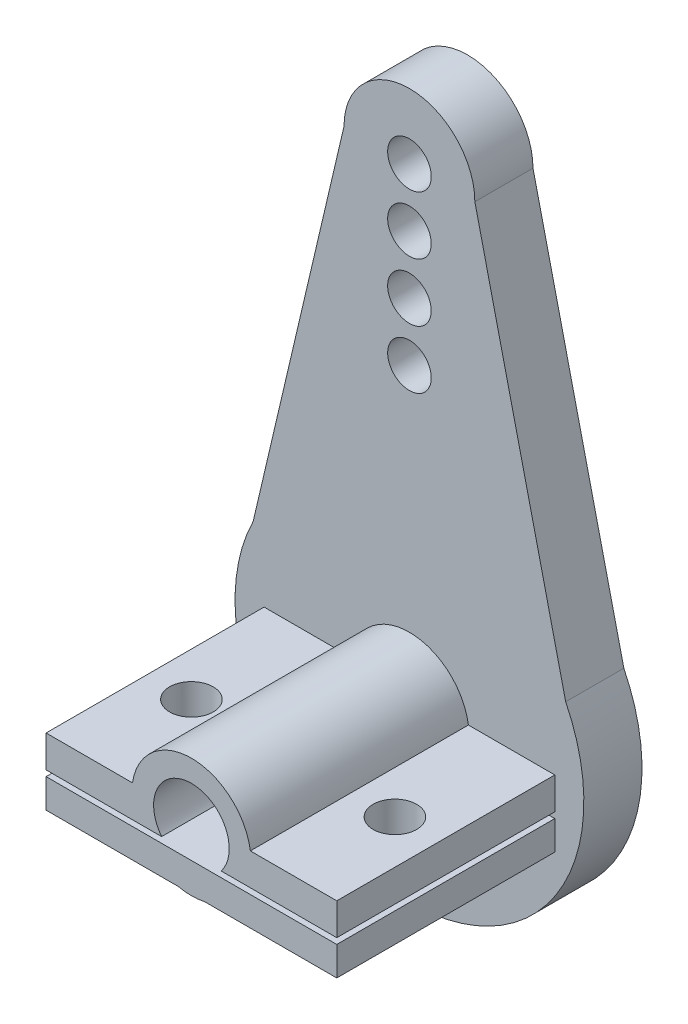
ISO-10303-21;
HEADER;
FILE_DESCRIPTION(('STEP AP214'),'2;1');
FILE_NAME('part.step','',(''),(''),'','','');
FILE_SCHEMA(('AUTOMOTIVE_DESIGN { 1 0 10303 214 1 1 1 1 }'));
ENDSEC;
DATA;
#1=APPLICATION_CONTEXT('core data for automotive mechanical design processes');
#2=APPLICATION_PROTOCOL_DEFINITION('international standard','automotive_design',2000,#1);
#3=PRODUCT_CONTEXT('',#1,'mechanical');
#4=PRODUCT('Part','Part','',(#3));
#5=PRODUCT_RELATED_PRODUCT_CATEGORY('part','',(#4));
#6=PRODUCT_DEFINITION_FORMATION('','',#4);
#7=PRODUCT_DEFINITION_CONTEXT('part definition',#1,'design');
#8=PRODUCT_DEFINITION('design','',#6,#7);
#9=PRODUCT_DEFINITION_SHAPE('','',#8);
#10=(LENGTH_UNIT() NAMED_UNIT(*) SI_UNIT(.MILLI.,.METRE.));
#11=(NAMED_UNIT(*) PLANE_ANGLE_UNIT() SI_UNIT($,.RADIAN.));
#12=(NAMED_UNIT(*) SI_UNIT($,.STERADIAN.) SOLID_ANGLE_UNIT());
#13=UNCERTAINTY_MEASURE_WITH_UNIT(LENGTH_MEASURE(1.E-05),#10,'distance_accuracy_value','');
#14=(GEOMETRIC_REPRESENTATION_CONTEXT(3) GLOBAL_UNCERTAINTY_ASSIGNED_CONTEXT((#13)) GLOBAL_UNIT_ASSIGNED_CONTEXT((#10,
#11,#12)) REPRESENTATION_CONTEXT('',''));
#15=CARTESIAN_POINT('',(0.,0.,0.));
#16=DIRECTION('',(0.,0.,1.));
#17=DIRECTION('',(1.,0.,0.));
#18=AXIS2_PLACEMENT_3D('',#15,#16,#17);
#19=CARTESIAN_POINT('',(0.,0.,19.));
#20=DIRECTION('',(0.,0.,-1.));
#21=DIRECTION('',(-1.,0.,0.));
#22=AXIS2_PLACEMENT_3D('',#19,#20,#21);
#23=CYLINDRICAL_SURFACE('',#22,4.1);
#24=DIRECTION('',(0.,0.,-1.));
#25=VECTOR('',#24,1.);
#26=CARTESIAN_POINT('',(4.05585995813465,0.6,19.));
#27=LINE('',#26,#25);
#28=CARTESIAN_POINT('',(4.05585995813465,0.6,4.));
#29=VERTEX_POINT('',#28);
#30=CARTESIAN_POINT('',(4.05585995813465,0.6,19.));
#31=VERTEX_POINT('',#30);
#32=EDGE_CURVE('E188',#29,#31,#27,.F.);
#33=ORIENTED_EDGE('',*,*,#32,.F.);
#34=CARTESIAN_POINT('',(0.,0.,4.));
#35=DIRECTION('',(0.,0.,1.));
#36=DIRECTION('',(1.,0.,0.));
#37=AXIS2_PLACEMENT_3D('',#34,#35,#36);
#38=CIRCLE('',#37,4.1);
#39=CARTESIAN_POINT('',(-4.05585995813465,0.600000000000001,4.));
#40=VERTEX_POINT('',#39);
#41=EDGE_CURVE('E288',#29,#40,#38,.T.);
#42=ORIENTED_EDGE('',*,*,#41,.T.);
#43=DIRECTION('',(0.,0.,-1.));
#44=VECTOR('',#43,1.);
#45=CARTESIAN_POINT('',(-4.05585995813465,0.600000000000001,19.));
#46=LINE('',#45,#44);
#47=CARTESIAN_POINT('',(-4.05585995813465,0.600000000000001,19.));
#48=VERTEX_POINT('',#47);
#49=EDGE_CURVE('E231',#48,#40,#46,.T.);
#50=ORIENTED_EDGE('',*,*,#49,.F.);
#51=CARTESIAN_POINT('',(0.,0.,19.));
#52=DIRECTION('',(0.,0.,1.));
#53=DIRECTION('',(1.,0.,0.));
#54=AXIS2_PLACEMENT_3D('',#51,#52,#53);
#55=CIRCLE('',#54,4.1);
#56=EDGE_CURVE('E289',#31,#48,#55,.T.);
#57=ORIENTED_EDGE('',*,*,#56,.F.);
#58=EDGE_LOOP('',(#33,#42,#50,#57));
#59=FACE_BOUND('',#58,.T.);
#60=ADVANCED_FACE('F39',(#59),#23,.T.);
#61=CARTESIAN_POINT('',(0.,0.,4.));
#62=DIRECTION('',(0.,0.,1.));
#63=DIRECTION('',(1.,0.,0.));
#64=AXIS2_PLACEMENT_3D('',#61,#62,#63);
#65=PLANE('',#64);
#66=DIRECTION('',(1.,0.,0.));
#67=VECTOR('',#66,1.);
#68=CARTESIAN_POINT('',(0.,-2.,4.));
#69=LINE('',#68,#67);
#70=CARTESIAN_POINT('',(-10.,-2.,4.));
#71=VERTEX_POINT('',#70);
#72=CARTESIAN_POINT('',(10.,-2.,4.));
#73=VERTEX_POINT('',#72);
#74=EDGE_CURVE('E377',#71,#73,#69,.T.);
#75=ORIENTED_EDGE('',*,*,#74,.T.);
#76=DIRECTION('',(0.,1.,0.));
#77=VECTOR('',#76,1.);
#78=CARTESIAN_POINT('',(10.,-2.,4.));
#79=LINE('',#78,#77);
#80=CARTESIAN_POINT('',(10.,-4.,4.));
#81=VERTEX_POINT('',#80);
#82=EDGE_CURVE('E250',#81,#73,#79,.T.);
#83=ORIENTED_EDGE('',*,*,#82,.F.);
#84=DIRECTION('',(1.,0.,0.));
#85=VECTOR('',#84,1.);
#86=CARTESIAN_POINT('',(-10.,-4.,4.));
#87=LINE('',#86,#85);
#88=CARTESIAN_POINT('',(0.899999999999999,-4.,4.));
#89=VERTEX_POINT('',#88);
#90=EDGE_CURVE('E265',#89,#81,#87,.T.);
#91=ORIENTED_EDGE('',*,*,#90,.F.);
#92=CARTESIAN_POINT('',(-0.899999999999999,-4.,4.));
#93=VERTEX_POINT('',#92);
#94=EDGE_CURVE('E293',#93,#89,#38,.T.);
#95=ORIENTED_EDGE('',*,*,#94,.F.);
#96=CARTESIAN_POINT('',(-10.,-4.,4.));
#97=VERTEX_POINT('',#96);
#98=EDGE_CURVE('E266',#97,#93,#87,.T.);
#99=ORIENTED_EDGE('',*,*,#98,.F.);
#100=DIRECTION('',(0.,-1.,0.));
#101=VECTOR('',#100,1.);
#102=CARTESIAN_POINT('',(-10.,-2.,4.));
#103=LINE('',#102,#101);
#104=EDGE_CURVE('E244',#71,#97,#103,.T.);
#105=ORIENTED_EDGE('',*,*,#104,.F.);
#106=EDGE_LOOP('',(#75,#83,#91,#95,#99,#105));
#107=FACE_BOUND('',#106,.T.);
#108=CARTESIAN_POINT('',(0.,32.,4.));
#109=DIRECTION('',(0.,0.,1.));
#110=DIRECTION('',(1.,0.,0.));
#111=AXIS2_PLACEMENT_3D('',#108,#109,#110);
#112=CIRCLE('',#111,1.5);
#113=CARTESIAN_POINT('',(1.5,32.,4.));
#114=VERTEX_POINT('',#113);
#115=EDGE_CURVE('E301',#114,#114,#112,.F.);
#116=ORIENTED_EDGE('',*,*,#115,.T.);
#117=EDGE_LOOP('',(#116));
#118=FACE_BOUND('',#117,.T.);
#119=CARTESIAN_POINT('',(0.,24.,4.));
#120=DIRECTION('',(0.,0.,1.));
#121=DIRECTION('',(1.,0.,0.));
#122=AXIS2_PLACEMENT_3D('',#119,#120,#121);
#123=CIRCLE('',#122,1.5);
#124=CARTESIAN_POINT('',(1.5,24.,4.));
#125=VERTEX_POINT('',#124);
#126=EDGE_CURVE('E311',#125,#125,#123,.F.);
#127=ORIENTED_EDGE('',*,*,#126,.T.);
#128=EDGE_LOOP('',(#127));
#129=FACE_BOUND('',#128,.T.);
#130=CARTESIAN_POINT('',(0.,20.,4.));
#131=DIRECTION('',(0.,0.,1.));
#132=DIRECTION('',(1.,0.,0.));
#133=AXIS2_PLACEMENT_3D('',#130,#131,#132);
#134=CIRCLE('',#133,1.5);
#135=CARTESIAN_POINT('',(1.5,20.,4.));
#136=VERTEX_POINT('',#135);
#137=EDGE_CURVE('E310',#136,#136,#134,.F.);
#138=ORIENTED_EDGE('',*,*,#137,.T.);
#139=EDGE_LOOP('',(#138));
#140=FACE_BOUND('',#139,.T.);
#141=CARTESIAN_POINT('',(0.,28.,4.));
#142=DIRECTION('',(0.,0.,1.));
#143=DIRECTION('',(1.,0.,0.));
#144=AXIS2_PLACEMENT_3D('',#141,#142,#143);
#145=CIRCLE('',#144,1.5);
#146=CARTESIAN_POINT('',(1.5,28.,4.));
#147=VERTEX_POINT('',#146);
#148=EDGE_CURVE('E318',#147,#147,#145,.F.);
#149=ORIENTED_EDGE('',*,*,#148,.T.);
#150=EDGE_LOOP('',(#149));
#151=FACE_BOUND('',#150,.T.);
#152=DIRECTION('',(0.228191322789328,-0.973616310567801,0.));
#153=VECTOR('',#152,1.);
#154=CARTESIAN_POINT('',(4.5,32.,4.));
#155=LINE('',#154,#153);
#156=CARTESIAN_POINT('',(4.5,32.,4.));
#157=VERTEX_POINT('',#156);
#158=CARTESIAN_POINT('',(10.7502892848878,5.33209905114555,4.));
#159=VERTEX_POINT('',#158);
#160=EDGE_CURVE('E336',#157,#159,#155,.T.);
#161=ORIENTED_EDGE('',*,*,#160,.F.);
#162=CARTESIAN_POINT('',(0.,32.,4.));
#163=DIRECTION('',(0.,0.,1.));
#164=DIRECTION('',(1.,0.,0.));
#165=AXIS2_PLACEMENT_3D('',#162,#163,#164);
#166=CIRCLE('',#165,4.5);
#167=CARTESIAN_POINT('',(-4.5,32.,4.));
#168=VERTEX_POINT('',#167);
#169=EDGE_CURVE('E329',#157,#168,#166,.T.);
#170=ORIENTED_EDGE('',*,*,#169,.T.);
#171=DIRECTION('',(0.228191322789328,0.973616310567801,0.));
#172=VECTOR('',#171,1.);
#173=CARTESIAN_POINT('',(-12.,0.,4.));
#174=LINE('',#173,#172);
#175=CARTESIAN_POINT('',(-10.7502892848878,5.33209905114555,4.));
#176=VERTEX_POINT('',#175);
#177=EDGE_CURVE('E340',#176,#168,#174,.T.);
#178=ORIENTED_EDGE('',*,*,#177,.F.);
#179=CARTESIAN_POINT('',(0.,0.,4.));
#180=DIRECTION('',(0.,0.,1.));
#181=DIRECTION('',(1.,0.,0.));
#182=AXIS2_PLACEMENT_3D('',#179,#180,#181);
#183=CIRCLE('',#182,12.);
#184=EDGE_CURVE('E367',#176,#159,#183,.T.);
#185=ORIENTED_EDGE('',*,*,#184,.T.);
#186=EDGE_LOOP('',(#161,#170,#178,#185));
#187=FACE_BOUND('',#186,.T.);
#188=DIRECTION('',(0.,1.,0.));
#189=VECTOR('',#188,1.);
#190=CARTESIAN_POINT('',(10.,-1.6,4.));
#191=LINE('',#190,#189);
#192=CARTESIAN_POINT('',(10.,-1.6,4.));
#193=VERTEX_POINT('',#192);
#194=CARTESIAN_POINT('',(10.,0.6,4.));
#195=VERTEX_POINT('',#194);
#196=EDGE_CURVE('E198',#193,#195,#191,.T.);
#197=ORIENTED_EDGE('',*,*,#196,.F.);
#198=DIRECTION('',(-1.,0.,0.));
#199=VECTOR('',#198,1.);
#200=CARTESIAN_POINT('',(-10.,-1.6,4.));
#201=LINE('',#200,#199);
#202=CARTESIAN_POINT('',(2.04939015319192,-1.6,4.));
#203=VERTEX_POINT('',#202);
#204=EDGE_CURVE('E184',#193,#203,#201,.T.);
#205=ORIENTED_EDGE('',*,*,#204,.T.);
#206=CARTESIAN_POINT('',(0.,0.,4.));
#207=DIRECTION('',(0.,0.,1.));
#208=DIRECTION('',(1.,0.,0.));
#209=AXIS2_PLACEMENT_3D('',#206,#207,#208);
#210=CIRCLE('',#209,2.6);
#211=CARTESIAN_POINT('',(-2.04939015319192,-1.6,4.));
#212=VERTEX_POINT('',#211);
#213=EDGE_CURVE('E371',#212,#203,#210,.F.);
#214=ORIENTED_EDGE('',*,*,#213,.F.);
#215=CARTESIAN_POINT('',(-10.,-1.6,4.));
#216=VERTEX_POINT('',#215);
#217=EDGE_CURVE('E63',#212,#216,#201,.T.);
#218=ORIENTED_EDGE('',*,*,#217,.T.);
#219=DIRECTION('',(0.,-1.,0.));
#220=VECTOR('',#219,1.);
#221=CARTESIAN_POINT('',(-10.,-1.6,4.));
#222=LINE('',#221,#220);
#223=CARTESIAN_POINT('',(-10.,0.6,4.));
#224=VERTEX_POINT('',#223);
#225=EDGE_CURVE('E215',#224,#216,#222,.T.);
#226=ORIENTED_EDGE('',*,*,#225,.F.);
#227=DIRECTION('',(-1.,0.,0.));
#228=VECTOR('',#227,1.);
#229=CARTESIAN_POINT('',(-3.0448472304101,0.600000000000001,4.));
#230=LINE('',#229,#228);
#231=EDGE_CURVE('E210',#40,#224,#230,.T.);
#232=ORIENTED_EDGE('',*,*,#231,.F.);
#233=ORIENTED_EDGE('',*,*,#41,.F.);
#234=DIRECTION('',(-1.,0.,0.));
#235=VECTOR('',#234,1.);
#236=CARTESIAN_POINT('',(3.3540621182031,0.6,4.));
#237=LINE('',#236,#235);
#238=EDGE_CURVE('E193',#195,#29,#237,.T.);
#239=ORIENTED_EDGE('',*,*,#238,.F.);
#240=EDGE_LOOP('',(#197,#205,#214,#218,#226,#232,#233,#239));
#241=FACE_BOUND('',#240,.T.);
#242=ADVANCED_FACE('F398',(#107,#118,#129,#140,#151,#187,#241),#65,.T.);
#243=CARTESIAN_POINT('',(0.,0.,19.));
#244=DIRECTION('',(0.,0.,-1.));
#245=DIRECTION('',(-1.,0.,0.));
#246=AXIS2_PLACEMENT_3D('',#243,#244,#245);
#247=CYLINDRICAL_SURFACE('',#246,2.6);
#248=CARTESIAN_POINT('',(0.,0.,19.));
#249=DIRECTION('',(0.,0.,1.));
#250=DIRECTION('',(1.,0.,0.));
#251=AXIS2_PLACEMENT_3D('',#248,#249,#250);
#252=CIRCLE('',#251,2.6);
#253=CARTESIAN_POINT('',(2.04939015319192,-1.6,19.));
#254=VERTEX_POINT('',#253);
#255=CARTESIAN_POINT('',(-2.04939015319192,-1.6,19.));
#256=VERTEX_POINT('',#255);
#257=EDGE_CURVE('E173',#254,#256,#252,.T.);
#258=ORIENTED_EDGE('',*,*,#257,.T.);
#259=DIRECTION('',(0.,0.,-1.));
#260=VECTOR('',#259,1.);
#261=CARTESIAN_POINT('',(-2.04939015319192,-1.6,19.));
#262=LINE('',#261,#260);
#263=EDGE_CURVE('E240',#256,#212,#262,.T.);
#264=ORIENTED_EDGE('',*,*,#263,.T.);
#265=ORIENTED_EDGE('',*,*,#213,.T.);
#266=DIRECTION('',(0.,0.,-1.));
#267=VECTOR('',#266,1.);
#268=CARTESIAN_POINT('',(2.04939015319192,-1.6,19.));
#269=LINE('',#268,#267);
#270=EDGE_CURVE('E178',#203,#254,#269,.F.);
#271=ORIENTED_EDGE('',*,*,#270,.T.);
#272=EDGE_LOOP('',(#258,#264,#265,#271));
#273=FACE_BOUND('',#272,.T.);
#274=ADVANCED_FACE('F401',(#273),#247,.F.);
#275=CARTESIAN_POINT('',(0.,0.,19.));
#276=DIRECTION('',(0.,0.,1.));
#277=DIRECTION('',(1.,0.,0.));
#278=AXIS2_PLACEMENT_3D('',#275,#276,#277);
#279=PLANE('',#278);
#280=DIRECTION('',(0.,1.,0.));
#281=VECTOR('',#280,1.);
#282=CARTESIAN_POINT('',(10.,-2.,19.));
#283=LINE('',#282,#281);
#284=CARTESIAN_POINT('',(10.,-4.,19.));
#285=VERTEX_POINT('',#284);
#286=CARTESIAN_POINT('',(10.,-2.,19.));
#287=VERTEX_POINT('',#286);
#288=EDGE_CURVE('E254',#285,#287,#283,.T.);
#289=ORIENTED_EDGE('',*,*,#288,.T.);
#290=DIRECTION('',(-1.,0.,0.));
#291=VECTOR('',#290,1.);
#292=CARTESIAN_POINT('',(-10.,-2.,19.));
#293=LINE('',#292,#291);
#294=CARTESIAN_POINT('',(-10.,-2.,19.));
#295=VERTEX_POINT('',#294);
#296=EDGE_CURVE('E258',#287,#295,#293,.T.);
#297=ORIENTED_EDGE('',*,*,#296,.T.);
#298=DIRECTION('',(0.,-1.,0.));
#299=VECTOR('',#298,1.);
#300=CARTESIAN_POINT('',(-10.,-2.,19.));
#301=LINE('',#300,#299);
#302=CARTESIAN_POINT('',(-10.,-4.,19.));
#303=VERTEX_POINT('',#302);
#304=EDGE_CURVE('E245',#295,#303,#301,.T.);
#305=ORIENTED_EDGE('',*,*,#304,.T.);
#306=DIRECTION('',(1.,0.,0.));
#307=VECTOR('',#306,1.);
#308=CARTESIAN_POINT('',(-10.,-4.,19.));
#309=LINE('',#308,#307);
#310=CARTESIAN_POINT('',(-0.899999999999999,-4.,19.));
#311=VERTEX_POINT('',#310);
#312=EDGE_CURVE('E251',#303,#311,#309,.T.);
#313=ORIENTED_EDGE('',*,*,#312,.T.);
#314=CARTESIAN_POINT('',(0.899999999999999,-4.,19.));
#315=VERTEX_POINT('',#314);
#316=EDGE_CURVE('E292',#311,#315,#55,.T.);
#317=ORIENTED_EDGE('',*,*,#316,.T.);
#318=EDGE_CURVE('E249',#315,#285,#309,.T.);
#319=ORIENTED_EDGE('',*,*,#318,.T.);
#320=EDGE_LOOP('',(#289,#297,#305,#313,#317,#319));
#321=FACE_BOUND('',#320,.T.);
#322=ADVANCED_FACE('F447',(#321),#279,.T.);
#323=ORIENTED_EDGE('',*,*,#257,.F.);
#324=DIRECTION('',(-1.,0.,0.));
#325=VECTOR('',#324,1.);
#326=CARTESIAN_POINT('',(-10.,-1.6,19.));
#327=LINE('',#326,#325);
#328=CARTESIAN_POINT('',(10.,-1.6,19.));
#329=VERTEX_POINT('',#328);
#330=EDGE_CURVE('E165',#329,#254,#327,.T.);
#331=ORIENTED_EDGE('',*,*,#330,.F.);
#332=DIRECTION('',(0.,1.,0.));
#333=VECTOR('',#332,1.);
#334=CARTESIAN_POINT('',(10.,-1.6,19.));
#335=LINE('',#334,#333);
#336=CARTESIAN_POINT('',(10.,0.6,19.));
#337=VERTEX_POINT('',#336);
#338=EDGE_CURVE('E170',#329,#337,#335,.T.);
#339=ORIENTED_EDGE('',*,*,#338,.T.);
#340=DIRECTION('',(-1.,0.,0.));
#341=VECTOR('',#340,1.);
#342=CARTESIAN_POINT('',(3.3540621182031,0.6,19.));
#343=LINE('',#342,#341);
#344=EDGE_CURVE('E192',#337,#31,#343,.T.);
#345=ORIENTED_EDGE('',*,*,#344,.T.);
#346=ORIENTED_EDGE('',*,*,#56,.T.);
#347=DIRECTION('',(-1.,0.,0.));
#348=VECTOR('',#347,1.);
#349=CARTESIAN_POINT('',(-3.0448472304101,0.600000000000001,19.));
#350=LINE('',#349,#348);
#351=CARTESIAN_POINT('',(-10.,0.6,19.));
#352=VERTEX_POINT('',#351);
#353=EDGE_CURVE('E211',#48,#352,#350,.T.);
#354=ORIENTED_EDGE('',*,*,#353,.T.);
#355=DIRECTION('',(0.,-1.,0.));
#356=VECTOR('',#355,1.);
#357=CARTESIAN_POINT('',(-10.,-1.6,19.));
#358=LINE('',#357,#356);
#359=CARTESIAN_POINT('',(-10.,-1.6,19.));
#360=VERTEX_POINT('',#359);
#361=EDGE_CURVE('E214',#352,#360,#358,.T.);
#362=ORIENTED_EDGE('',*,*,#361,.T.);
#363=EDGE_CURVE('E179',#256,#360,#327,.T.);
#364=ORIENTED_EDGE('',*,*,#363,.F.);
#365=EDGE_LOOP('',(#323,#331,#339,#345,#346,#354,#362,#364));
#366=FACE_BOUND('',#365,.T.);
#367=ADVANCED_FACE('F167',(#366),#279,.T.);
#368=DIRECTION('',(0.,0.,-1.));
#369=VECTOR('',#368,1.);
#370=CARTESIAN_POINT('',(0.899999999999999,-4.,19.));
#371=LINE('',#370,#369);
#372=EDGE_CURVE('E11',#315,#89,#371,.T.);
#373=ORIENTED_EDGE('',*,*,#372,.F.);
#374=ORIENTED_EDGE('',*,*,#316,.F.);
#375=DIRECTION('',(0.,0.,-1.));
#376=VECTOR('',#375,1.);
#377=CARTESIAN_POINT('',(-0.899999999999999,-4.,19.));
#378=LINE('',#377,#376);
#379=EDGE_CURVE('E48',#93,#311,#378,.F.);
#380=ORIENTED_EDGE('',*,*,#379,.F.);
#381=ORIENTED_EDGE('',*,*,#94,.T.);
#382=EDGE_LOOP('',(#373,#374,#380,#381));
#383=FACE_BOUND('',#382,.T.);
#384=ADVANCED_FACE('F391',(#383),#23,.T.);
#385=CARTESIAN_POINT('',(0.,0.,4.));
#386=DIRECTION('',(0.,0.,-1.));
#387=DIRECTION('',(-1.,0.,0.));
#388=AXIS2_PLACEMENT_3D('',#385,#386,#387);
#389=CYLINDRICAL_SURFACE('',#388,12.);
#390=ORIENTED_EDGE('',*,*,#184,.F.);
#391=DIRECTION('',(0.,0.,-1.));
#392=VECTOR('',#391,1.);
#393=CARTESIAN_POINT('',(-10.7502892848878,5.33209905114556,4.));
#394=LINE('',#393,#392);
#395=CARTESIAN_POINT('',(-10.7502892848878,5.33209905114555,0.));
#396=VERTEX_POINT('',#395);
#397=EDGE_CURVE('E362',#176,#396,#394,.T.);
#398=ORIENTED_EDGE('',*,*,#397,.T.);
#399=CARTESIAN_POINT('',(0.,0.,0.));
#400=DIRECTION('',(0.,0.,1.));
#401=DIRECTION('',(1.,0.,0.));
#402=AXIS2_PLACEMENT_3D('',#399,#400,#401);
#403=CIRCLE('',#402,12.);
#404=CARTESIAN_POINT('',(10.7502892848878,5.33209905114555,0.));
#405=VERTEX_POINT('',#404);
#406=EDGE_CURVE('E366',#396,#405,#403,.T.);
#407=ORIENTED_EDGE('',*,*,#406,.T.);
#408=DIRECTION('',(0.,0.,-1.));
#409=VECTOR('',#408,1.);
#410=CARTESIAN_POINT('',(10.7502892848878,5.33209905114556,4.));
#411=LINE('',#410,#409);
#412=EDGE_CURVE('E356',#405,#159,#411,.F.);
#413=ORIENTED_EDGE('',*,*,#412,.T.);
#414=EDGE_LOOP('',(#390,#398,#407,#413));
#415=FACE_BOUND('',#414,.T.);
#416=ADVANCED_FACE('F41',(#415),#389,.T.);
#417=CARTESIAN_POINT('',(0.,0.,0.));
#418=DIRECTION('',(0.,0.,1.));
#419=DIRECTION('',(1.,0.,0.));
#420=AXIS2_PLACEMENT_3D('',#417,#418,#419);
#421=PLANE('',#420);
#422=CARTESIAN_POINT('',(0.,32.,0.));
#423=DIRECTION('',(0.,0.,-1.));
#424=DIRECTION('',(-1.,0.,0.));
#425=AXIS2_PLACEMENT_3D('',#422,#423,#424);
#426=CIRCLE('',#425,1.5);
#427=CARTESIAN_POINT('',(-1.5,32.,0.));
#428=VERTEX_POINT('',#427);
#429=EDGE_CURVE('E296',#428,#428,#426,.T.);
#430=ORIENTED_EDGE('',*,*,#429,.F.);
#431=EDGE_LOOP('',(#430));
#432=FACE_BOUND('',#431,.T.);
#433=CARTESIAN_POINT('',(0.,24.,0.));
#434=DIRECTION('',(0.,0.,-1.));
#435=DIRECTION('',(-1.,0.,0.));
#436=AXIS2_PLACEMENT_3D('',#433,#434,#435);
#437=CIRCLE('',#436,1.5);
#438=CARTESIAN_POINT('',(-1.5,24.,0.));
#439=VERTEX_POINT('',#438);
#440=EDGE_CURVE('E306',#439,#439,#437,.T.);
#441=ORIENTED_EDGE('',*,*,#440,.F.);
#442=EDGE_LOOP('',(#441));
#443=FACE_BOUND('',#442,.T.);
#444=CARTESIAN_POINT('',(0.,20.,0.));
#445=DIRECTION('',(0.,0.,-1.));
#446=DIRECTION('',(-1.,0.,0.));
#447=AXIS2_PLACEMENT_3D('',#444,#445,#446);
#448=CIRCLE('',#447,1.5);
#449=CARTESIAN_POINT('',(-1.5,20.,0.));
#450=VERTEX_POINT('',#449);
#451=EDGE_CURVE('E322',#450,#450,#448,.T.);
#452=ORIENTED_EDGE('',*,*,#451,.F.);
#453=EDGE_LOOP('',(#452));
#454=FACE_BOUND('',#453,.T.);
#455=CARTESIAN_POINT('',(0.,28.,0.));
#456=DIRECTION('',(0.,0.,-1.));
#457=DIRECTION('',(-1.,0.,0.));
#458=AXIS2_PLACEMENT_3D('',#455,#456,#457);
#459=CIRCLE('',#458,1.5);
#460=CARTESIAN_POINT('',(-1.5,28.,0.));
#461=VERTEX_POINT('',#460);
#462=EDGE_CURVE('E305',#461,#461,#459,.T.);
#463=ORIENTED_EDGE('',*,*,#462,.F.);
#464=EDGE_LOOP('',(#463));
#465=FACE_BOUND('',#464,.T.);
#466=DIRECTION('',(0.228191322789328,0.973616310567801,0.));
#467=VECTOR('',#466,1.);
#468=CARTESIAN_POINT('',(-12.,0.,0.));
#469=LINE('',#468,#467);
#470=CARTESIAN_POINT('',(-4.5,32.,0.));
#471=VERTEX_POINT('',#470);
#472=EDGE_CURVE('E341',#396,#471,#469,.T.);
#473=ORIENTED_EDGE('',*,*,#472,.T.);
#474=CARTESIAN_POINT('',(0.,32.,0.));
#475=DIRECTION('',(0.,0.,1.));
#476=DIRECTION('',(1.,0.,0.));
#477=AXIS2_PLACEMENT_3D('',#474,#475,#476);
#478=CIRCLE('',#477,4.5);
#479=CARTESIAN_POINT('',(4.5,32.,0.));
#480=VERTEX_POINT('',#479);
#481=EDGE_CURVE('E300',#480,#471,#478,.T.);
#482=ORIENTED_EDGE('',*,*,#481,.F.);
#483=DIRECTION('',(0.228191322789328,-0.973616310567801,0.));
#484=VECTOR('',#483,1.);
#485=CARTESIAN_POINT('',(4.5,32.,0.));
#486=LINE('',#485,#484);
#487=EDGE_CURVE('E333',#480,#405,#486,.T.);
#488=ORIENTED_EDGE('',*,*,#487,.T.);
#489=ORIENTED_EDGE('',*,*,#406,.F.);
#490=EDGE_LOOP('',(#473,#482,#488,#489));
#491=FACE_BOUND('',#490,.T.);
#492=ADVANCED_FACE('F445',(#432,#443,#454,#465,#491),#421,.F.);
#493=CARTESIAN_POINT('',(-12.,0.,4.));
#494=DIRECTION('',(-0.973616310567801,0.228191322789328,0.));
#495=DIRECTION('',(-0.228191322789328,-0.973616310567801,0.));
#496=AXIS2_PLACEMENT_3D('',#493,#494,#495);
#497=PLANE('',#496);
#498=ORIENTED_EDGE('',*,*,#397,.F.);
#499=ORIENTED_EDGE('',*,*,#177,.T.);
#500=DIRECTION('',(0.,0.,-1.));
#501=VECTOR('',#500,1.);
#502=CARTESIAN_POINT('',(-4.5,32.,4.));
#503=LINE('',#502,#501);
#504=EDGE_CURVE('E352',#168,#471,#503,.T.);
#505=ORIENTED_EDGE('',*,*,#504,.T.);
#506=ORIENTED_EDGE('',*,*,#472,.F.);
#507=EDGE_LOOP('',(#498,#499,#505,#506));
#508=FACE_BOUND('',#507,.T.);
#509=ADVANCED_FACE('F719',(#508),#497,.T.);
#510=CARTESIAN_POINT('',(4.5,32.,4.));
#511=DIRECTION('',(0.973616310567801,0.228191322789328,0.));
#512=DIRECTION('',(-0.228191322789328,0.973616310567801,0.));
#513=AXIS2_PLACEMENT_3D('',#510,#511,#512);
#514=PLANE('',#513);
#515=ORIENTED_EDGE('',*,*,#412,.F.);
#516=ORIENTED_EDGE('',*,*,#487,.F.);
#517=DIRECTION('',(0.,0.,-1.));
#518=VECTOR('',#517,1.);
#519=CARTESIAN_POINT('',(4.5,32.,4.));
#520=LINE('',#519,#518);
#521=EDGE_CURVE('E345',#157,#480,#520,.T.);
#522=ORIENTED_EDGE('',*,*,#521,.F.);
#523=ORIENTED_EDGE('',*,*,#160,.T.);
#524=EDGE_LOOP('',(#515,#516,#522,#523));
#525=FACE_BOUND('',#524,.T.);
#526=ADVANCED_FACE('F730',(#525),#514,.T.);
#527=CARTESIAN_POINT('',(0.,32.,4.));
#528=DIRECTION('',(0.,0.,-1.));
#529=DIRECTION('',(-1.,0.,0.));
#530=AXIS2_PLACEMENT_3D('',#527,#528,#529);
#531=CYLINDRICAL_SURFACE('',#530,4.5);
#532=ORIENTED_EDGE('',*,*,#521,.T.);
#533=ORIENTED_EDGE('',*,*,#481,.T.);
#534=ORIENTED_EDGE('',*,*,#504,.F.);
#535=ORIENTED_EDGE('',*,*,#169,.F.);
#536=EDGE_LOOP('',(#532,#533,#534,#535));
#537=FACE_BOUND('',#536,.T.);
#538=ADVANCED_FACE('F707',(#537),#531,.T.);
#539=CARTESIAN_POINT('',(0.,28.,4.001));
#540=DIRECTION('',(0.,0.,-1.));
#541=DIRECTION('',(-1.,0.,0.));
#542=AXIS2_PLACEMENT_3D('',#539,#540,#541);
#543=CYLINDRICAL_SURFACE('',#542,1.5);
#544=ORIENTED_EDGE('',*,*,#148,.F.);
#545=EDGE_LOOP('',(#544));
#546=FACE_BOUND('',#545,.T.);
#547=ORIENTED_EDGE('',*,*,#462,.T.);
#548=EDGE_LOOP('',(#547));
#549=FACE_BOUND('',#548,.T.);
#550=ADVANCED_FACE('F697',(#546,#549),#543,.F.);
#551=CARTESIAN_POINT('',(0.,20.,4.001));
#552=DIRECTION('',(0.,0.,-1.));
#553=DIRECTION('',(-1.,0.,0.));
#554=AXIS2_PLACEMENT_3D('',#551,#552,#553);
#555=CYLINDRICAL_SURFACE('',#554,1.5);
#556=ORIENTED_EDGE('',*,*,#137,.F.);
#557=EDGE_LOOP('',(#556));
#558=FACE_BOUND('',#557,.T.);
#559=ORIENTED_EDGE('',*,*,#451,.T.);
#560=EDGE_LOOP('',(#559));
#561=FACE_BOUND('',#560,.T.);
#562=ADVANCED_FACE('F687',(#558,#561),#555,.F.);
#563=CARTESIAN_POINT('',(0.,24.,4.001));
#564=DIRECTION('',(0.,0.,-1.));
#565=DIRECTION('',(-1.,0.,0.));
#566=AXIS2_PLACEMENT_3D('',#563,#564,#565);
#567=CYLINDRICAL_SURFACE('',#566,1.5);
#568=ORIENTED_EDGE('',*,*,#126,.F.);
#569=EDGE_LOOP('',(#568));
#570=FACE_BOUND('',#569,.T.);
#571=ORIENTED_EDGE('',*,*,#440,.T.);
#572=EDGE_LOOP('',(#571));
#573=FACE_BOUND('',#572,.T.);
#574=ADVANCED_FACE('F678',(#570,#573),#567,.F.);
#575=CARTESIAN_POINT('',(0.,32.,4.001));
#576=DIRECTION('',(0.,0.,-1.));
#577=DIRECTION('',(-1.,0.,0.));
#578=AXIS2_PLACEMENT_3D('',#575,#576,#577);
#579=CYLINDRICAL_SURFACE('',#578,1.5);
#580=ORIENTED_EDGE('',*,*,#115,.F.);
#581=EDGE_LOOP('',(#580));
#582=FACE_BOUND('',#581,.T.);
#583=ORIENTED_EDGE('',*,*,#429,.T.);
#584=EDGE_LOOP('',(#583));
#585=FACE_BOUND('',#584,.T.);
#586=ADVANCED_FACE('F463',(#582,#585),#579,.F.);
#587=CARTESIAN_POINT('',(-10.,-4.,19.));
#588=DIRECTION('',(0.,1.,0.));
#589=DIRECTION('',(0.,0.,1.));
#590=AXIS2_PLACEMENT_3D('',#587,#588,#589);
#591=PLANE('',#590);
#592=CARTESIAN_POINT('',(7.,-4.,12.));
#593=DIRECTION('',(0.,1.,0.));
#594=DIRECTION('',(0.,0.,1.));
#595=AXIS2_PLACEMENT_3D('',#592,#593,#594);
#596=CIRCLE('',#595,1.5);
#597=CARTESIAN_POINT('',(7.,-4.,13.5));
#598=VERTEX_POINT('',#597);
#599=EDGE_CURVE('E497',#598,#598,#596,.T.);
#600=ORIENTED_EDGE('',*,*,#599,.T.);
#601=EDGE_LOOP('',(#600));
#602=FACE_BOUND('',#601,.T.);
#603=ORIENTED_EDGE('',*,*,#318,.F.);
#604=ORIENTED_EDGE('',*,*,#372,.T.);
#605=ORIENTED_EDGE('',*,*,#90,.T.);
#606=DIRECTION('',(0.,0.,-1.));
#607=VECTOR('',#606,1.);
#608=CARTESIAN_POINT('',(10.,-4.,19.));
#609=LINE('',#608,#607);
#610=EDGE_CURVE('E279',#285,#81,#609,.T.);
#611=ORIENTED_EDGE('',*,*,#610,.F.);
#612=EDGE_LOOP('',(#603,#604,#605,#611));
#613=FACE_BOUND('',#612,.T.);
#614=ADVANCED_FACE('F459',(#602,#613),#591,.F.);
#615=CARTESIAN_POINT('',(10.,-2.,19.));
#616=DIRECTION('',(-1.,0.,0.));
#617=DIRECTION('',(0.,0.,1.));
#618=AXIS2_PLACEMENT_3D('',#615,#616,#617);
#619=PLANE('',#618);
#620=ORIENTED_EDGE('',*,*,#82,.T.);
#621=DIRECTION('',(0.,0.,-1.));
#622=VECTOR('',#621,1.);
#623=CARTESIAN_POINT('',(10.,-2.,19.));
#624=LINE('',#623,#622);
#625=EDGE_CURVE('E275',#287,#73,#624,.T.);
#626=ORIENTED_EDGE('',*,*,#625,.F.);
#627=ORIENTED_EDGE('',*,*,#288,.F.);
#628=ORIENTED_EDGE('',*,*,#610,.T.);
#629=EDGE_LOOP('',(#620,#626,#627,#628));
#630=FACE_BOUND('',#629,.T.);
#631=ADVANCED_FACE('F462',(#630),#619,.F.);
#632=CARTESIAN_POINT('',(-7.,-4.,12.));
#633=DIRECTION('',(0.,1.,0.));
#634=DIRECTION('',(0.,0.,1.));
#635=AXIS2_PLACEMENT_3D('',#632,#633,#634);
#636=CIRCLE('',#635,1.5);
#637=CARTESIAN_POINT('',(-7.,-4.,13.5));
#638=VERTEX_POINT('',#637);
#639=EDGE_CURVE('E201',#638,#638,#636,.T.);
#640=ORIENTED_EDGE('',*,*,#639,.T.);
#641=EDGE_LOOP('',(#640));
#642=FACE_BOUND('',#641,.T.);
#643=ORIENTED_EDGE('',*,*,#98,.T.);
#644=ORIENTED_EDGE('',*,*,#379,.T.);
#645=ORIENTED_EDGE('',*,*,#312,.F.);
#646=DIRECTION('',(0.,0.,-1.));
#647=VECTOR('',#646,1.);
#648=CARTESIAN_POINT('',(-10.,-4.,19.));
#649=LINE('',#648,#647);
#650=EDGE_CURVE('E283',#303,#97,#649,.T.);
#651=ORIENTED_EDGE('',*,*,#650,.T.);
#652=EDGE_LOOP('',(#643,#644,#645,#651));
#653=FACE_BOUND('',#652,.T.);
#654=ADVANCED_FACE('F384',(#642,#653),#591,.F.);
#655=CARTESIAN_POINT('',(-10.,-2.,19.));
#656=DIRECTION('',(0.,-1.,0.));
#657=DIRECTION('',(0.,0.,-1.));
#658=AXIS2_PLACEMENT_3D('',#655,#656,#657);
#659=PLANE('',#658);
#660=CARTESIAN_POINT('',(-7.,-2.,12.));
#661=DIRECTION('',(0.,-1.,0.));
#662=DIRECTION('',(0.,0.,-1.));
#663=AXIS2_PLACEMENT_3D('',#660,#661,#662);
#664=CIRCLE('',#663,1.5);
#665=CARTESIAN_POINT('',(-7.,-2.,10.5));
#666=VERTEX_POINT('',#665);
#667=EDGE_CURVE('E504',#666,#666,#664,.T.);
#668=ORIENTED_EDGE('',*,*,#667,.T.);
#669=EDGE_LOOP('',(#668));
#670=FACE_BOUND('',#669,.T.);
#671=CARTESIAN_POINT('',(7.,-2.,12.));
#672=DIRECTION('',(0.,-1.,0.));
#673=DIRECTION('',(0.,0.,-1.));
#674=AXIS2_PLACEMENT_3D('',#671,#672,#673);
#675=CIRCLE('',#674,1.5);
#676=CARTESIAN_POINT('',(7.,-2.,10.5));
#677=VERTEX_POINT('',#676);
#678=EDGE_CURVE('E489',#677,#677,#675,.T.);
#679=ORIENTED_EDGE('',*,*,#678,.T.);
#680=EDGE_LOOP('',(#679));
#681=FACE_BOUND('',#680,.T.);
#682=ORIENTED_EDGE('',*,*,#296,.F.);
#683=ORIENTED_EDGE('',*,*,#625,.T.);
#684=ORIENTED_EDGE('',*,*,#74,.F.);
#685=DIRECTION('',(0.,0.,-1.));
#686=VECTOR('',#685,1.);
#687=CARTESIAN_POINT('',(-10.,-2.,19.));
#688=LINE('',#687,#686);
#689=EDGE_CURVE('E261',#295,#71,#688,.T.);
#690=ORIENTED_EDGE('',*,*,#689,.F.);
#691=EDGE_LOOP('',(#682,#683,#684,#690));
#692=FACE_BOUND('',#691,.T.);
#693=ADVANCED_FACE('F457',(#670,#681,#692),#659,.F.);
#694=CARTESIAN_POINT('',(-10.,-2.,19.));
#695=DIRECTION('',(1.,0.,0.));
#696=DIRECTION('',(0.,0.,-1.));
#697=AXIS2_PLACEMENT_3D('',#694,#695,#696);
#698=PLANE('',#697);
#699=ORIENTED_EDGE('',*,*,#104,.T.);
#700=ORIENTED_EDGE('',*,*,#650,.F.);
#701=ORIENTED_EDGE('',*,*,#304,.F.);
#702=ORIENTED_EDGE('',*,*,#689,.T.);
#703=EDGE_LOOP('',(#699,#700,#701,#702));
#704=FACE_BOUND('',#703,.T.);
#705=ADVANCED_FACE('F454',(#704),#698,.F.);
#706=CARTESIAN_POINT('',(-10.,-1.6,19.));
#707=DIRECTION('',(0.,-1.,0.));
#708=DIRECTION('',(0.,0.,-1.));
#709=AXIS2_PLACEMENT_3D('',#706,#707,#708);
#710=PLANE('',#709);
#711=CARTESIAN_POINT('',(7.,-1.6,12.));
#712=DIRECTION('',(0.,-1.,0.));
#713=DIRECTION('',(0.,0.,-1.));
#714=AXIS2_PLACEMENT_3D('',#711,#712,#713);
#715=CIRCLE('',#714,1.5);
#716=CARTESIAN_POINT('',(7.,-1.6,10.5));
#717=VERTEX_POINT('',#716);
#718=EDGE_CURVE('E483',#717,#717,#715,.T.);
#719=ORIENTED_EDGE('',*,*,#718,.F.);
#720=EDGE_LOOP('',(#719));
#721=FACE_BOUND('',#720,.T.);
#722=ORIENTED_EDGE('',*,*,#330,.T.);
#723=ORIENTED_EDGE('',*,*,#270,.F.);
#724=ORIENTED_EDGE('',*,*,#204,.F.);
#725=DIRECTION('',(0.,0.,-1.));
#726=VECTOR('',#725,1.);
#727=CARTESIAN_POINT('',(10.,-1.6,19.));
#728=LINE('',#727,#726);
#729=EDGE_CURVE('E182',#329,#193,#728,.T.);
#730=ORIENTED_EDGE('',*,*,#729,.F.);
#731=EDGE_LOOP('',(#722,#723,#724,#730));
#732=FACE_BOUND('',#731,.T.);
#733=ADVANCED_FACE('F183',(#721,#732),#710,.T.);
#734=CARTESIAN_POINT('',(-7.,-1.6,12.));
#735=DIRECTION('',(0.,-1.,0.));
#736=DIRECTION('',(0.,0.,-1.));
#737=AXIS2_PLACEMENT_3D('',#734,#735,#736);
#738=CIRCLE('',#737,1.5);
#739=CARTESIAN_POINT('',(-7.,-1.6,10.5));
#740=VERTEX_POINT('',#739);
#741=EDGE_CURVE('E501',#740,#740,#738,.T.);
#742=ORIENTED_EDGE('',*,*,#741,.F.);
#743=EDGE_LOOP('',(#742));
#744=FACE_BOUND('',#743,.T.);
#745=DIRECTION('',(0.,0.,-1.));
#746=VECTOR('',#745,1.);
#747=CARTESIAN_POINT('',(-10.,-1.6,19.));
#748=LINE('',#747,#746);
#749=EDGE_CURVE('E219',#360,#216,#748,.T.);
#750=ORIENTED_EDGE('',*,*,#749,.T.);
#751=ORIENTED_EDGE('',*,*,#217,.F.);
#752=ORIENTED_EDGE('',*,*,#263,.F.);
#753=ORIENTED_EDGE('',*,*,#363,.T.);
#754=EDGE_LOOP('',(#750,#751,#752,#753));
#755=FACE_BOUND('',#754,.T.);
#756=ADVANCED_FACE('F403',(#744,#755),#710,.T.);
#757=CARTESIAN_POINT('',(-3.0448472304101,0.600000000000001,19.));
#758=DIRECTION('',(0.,-1.,0.));
#759=DIRECTION('',(1.,0.,0.));
#760=AXIS2_PLACEMENT_3D('',#757,#758,#759);
#761=PLANE('',#760);
#762=CARTESIAN_POINT('',(-7.,0.600000000000001,12.));
#763=DIRECTION('',(0.,1.,0.));
#764=DIRECTION('',(-1.,0.,0.));
#765=AXIS2_PLACEMENT_3D('',#762,#763,#764);
#766=CIRCLE('',#765,1.5);
#767=CARTESIAN_POINT('',(-8.5,0.600000000000001,12.));
#768=VERTEX_POINT('',#767);
#769=EDGE_CURVE('E480',#768,#768,#766,.T.);
#770=ORIENTED_EDGE('',*,*,#769,.F.);
#771=EDGE_LOOP('',(#770));
#772=FACE_BOUND('',#771,.T.);
#773=ORIENTED_EDGE('',*,*,#353,.F.);
#774=ORIENTED_EDGE('',*,*,#49,.T.);
#775=ORIENTED_EDGE('',*,*,#231,.T.);
#776=DIRECTION('',(0.,0.,-1.));
#777=VECTOR('',#776,1.);
#778=CARTESIAN_POINT('',(-10.,0.6,19.));
#779=LINE('',#778,#777);
#780=EDGE_CURVE('E227',#352,#224,#779,.T.);
#781=ORIENTED_EDGE('',*,*,#780,.F.);
#782=EDGE_LOOP('',(#773,#774,#775,#781));
#783=FACE_BOUND('',#782,.T.);
#784=ADVANCED_FACE('F413',(#772,#783),#761,.F.);
#785=CARTESIAN_POINT('',(-10.,-1.6,19.));
#786=DIRECTION('',(1.,0.,0.));
#787=DIRECTION('',(0.,0.,-1.));
#788=AXIS2_PLACEMENT_3D('',#785,#786,#787);
#789=PLANE('',#788);
#790=ORIENTED_EDGE('',*,*,#225,.T.);
#791=ORIENTED_EDGE('',*,*,#749,.F.);
#792=ORIENTED_EDGE('',*,*,#361,.F.);
#793=ORIENTED_EDGE('',*,*,#780,.T.);
#794=EDGE_LOOP('',(#790,#791,#792,#793));
#795=FACE_BOUND('',#794,.T.);
#796=ADVANCED_FACE('F409',(#795),#789,.F.);
#797=CARTESIAN_POINT('',(3.3540621182031,0.6,19.));
#798=DIRECTION('',(0.,-1.,0.));
#799=DIRECTION('',(0.,0.,-1.));
#800=AXIS2_PLACEMENT_3D('',#797,#798,#799);
#801=PLANE('',#800);
#802=CARTESIAN_POINT('',(7.,0.600000000000001,12.));
#803=DIRECTION('',(0.,1.,0.));
#804=DIRECTION('',(-1.,0.,0.));
#805=AXIS2_PLACEMENT_3D('',#802,#803,#804);
#806=CIRCLE('',#805,1.5);
#807=CARTESIAN_POINT('',(5.5,0.600000000000001,12.));
#808=VERTEX_POINT('',#807);
#809=EDGE_CURVE('E484',#808,#808,#806,.T.);
#810=ORIENTED_EDGE('',*,*,#809,.F.);
#811=EDGE_LOOP('',(#810));
#812=FACE_BOUND('',#811,.T.);
#813=ORIENTED_EDGE('',*,*,#238,.T.);
#814=ORIENTED_EDGE('',*,*,#32,.T.);
#815=ORIENTED_EDGE('',*,*,#344,.F.);
#816=DIRECTION('',(0.,0.,-1.));
#817=VECTOR('',#816,1.);
#818=CARTESIAN_POINT('',(10.,0.6,19.));
#819=LINE('',#818,#817);
#820=EDGE_CURVE('E55',#337,#195,#819,.T.);
#821=ORIENTED_EDGE('',*,*,#820,.T.);
#822=EDGE_LOOP('',(#813,#814,#815,#821));
#823=FACE_BOUND('',#822,.T.);
#824=ADVANCED_FACE('F418',(#812,#823),#801,.F.);
#825=CARTESIAN_POINT('',(10.,-1.6,19.));
#826=DIRECTION('',(-1.,0.,0.));
#827=DIRECTION('',(0.,0.,1.));
#828=AXIS2_PLACEMENT_3D('',#825,#826,#827);
#829=PLANE('',#828);
#830=ORIENTED_EDGE('',*,*,#196,.T.);
#831=ORIENTED_EDGE('',*,*,#820,.F.);
#832=ORIENTED_EDGE('',*,*,#338,.F.);
#833=ORIENTED_EDGE('',*,*,#729,.T.);
#834=EDGE_LOOP('',(#830,#831,#832,#833));
#835=FACE_BOUND('',#834,.T.);
#836=ADVANCED_FACE('F190',(#835),#829,.F.);
#837=CARTESIAN_POINT('',(7.,-4.4,12.));
#838=DIRECTION('',(0.,1.,0.));
#839=DIRECTION('',(-1.,0.,0.));
#840=AXIS2_PLACEMENT_3D('',#837,#838,#839);
#841=CYLINDRICAL_SURFACE('',#840,1.5);
#842=ORIENTED_EDGE('',*,*,#718,.T.);
#843=EDGE_LOOP('',(#842));
#844=FACE_BOUND('',#843,.T.);
#845=ORIENTED_EDGE('',*,*,#809,.T.);
#846=EDGE_LOOP('',(#845));
#847=FACE_BOUND('',#846,.T.);
#848=ADVANCED_FACE('F426',(#844,#847),#841,.F.);
#849=CARTESIAN_POINT('',(-7.,-4.4,12.));
#850=DIRECTION('',(0.,1.,0.));
#851=DIRECTION('',(-1.,0.,0.));
#852=AXIS2_PLACEMENT_3D('',#849,#850,#851);
#853=CYLINDRICAL_SURFACE('',#852,1.5);
#854=ORIENTED_EDGE('',*,*,#741,.T.);
#855=EDGE_LOOP('',(#854));
#856=FACE_BOUND('',#855,.T.);
#857=ORIENTED_EDGE('',*,*,#769,.T.);
#858=EDGE_LOOP('',(#857));
#859=FACE_BOUND('',#858,.T.);
#860=ADVANCED_FACE('F518',(#856,#859),#853,.F.);
#861=ORIENTED_EDGE('',*,*,#678,.F.);
#862=EDGE_LOOP('',(#861));
#863=FACE_BOUND('',#862,.T.);
#864=ORIENTED_EDGE('',*,*,#599,.F.);
#865=EDGE_LOOP('',(#864));
#866=FACE_BOUND('',#865,.T.);
#867=ADVANCED_FACE('F515',(#863,#866),#841,.F.);
#868=ORIENTED_EDGE('',*,*,#667,.F.);
#869=EDGE_LOOP('',(#868));
#870=FACE_BOUND('',#869,.T.);
#871=ORIENTED_EDGE('',*,*,#639,.F.);
#872=EDGE_LOOP('',(#871));
#873=FACE_BOUND('',#872,.T.);
#874=ADVANCED_FACE('F513',(#870,#873),#853,.F.);
#875=CLOSED_SHELL('',(#60,#242,#274,#322,#367,#384,#416,#492,#509,#526,#538,#550,#562,#574,#586,
#614,#631,#654,#693,#705,#733,#756,#784,#796,#824,#836,#848,#860,#867,#874));
#876=MANIFOLD_SOLID_BREP('B2',#875);
#877=ADVANCED_BREP_SHAPE_REPRESENTATION('',(#18,#876),#14);
#878=SHAPE_DEFINITION_REPRESENTATION(#9,#877);
ENDSEC;
END-ISO-10303-21;
